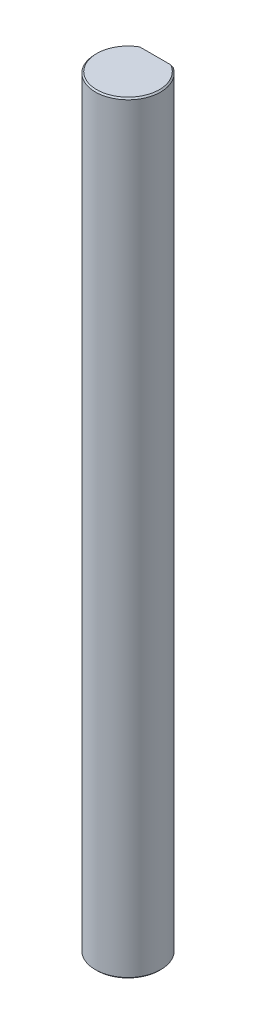
ISO-10303-21;
HEADER;
FILE_DESCRIPTION(('STEP AP214'),'2;1');
FILE_NAME('part.step','',(''),(''),'','','');
FILE_SCHEMA(('AUTOMOTIVE_DESIGN { 1 0 10303 214 1 1 1 1 }'));
ENDSEC;
DATA;
#1=APPLICATION_CONTEXT('core data for automotive mechanical design processes');
#2=APPLICATION_PROTOCOL_DEFINITION('international standard','automotive_design',2000,#1);
#3=PRODUCT_CONTEXT('',#1,'mechanical');
#4=PRODUCT('Part','Part','',(#3));
#5=PRODUCT_RELATED_PRODUCT_CATEGORY('part','',(#4));
#6=PRODUCT_DEFINITION_FORMATION('','',#4);
#7=PRODUCT_DEFINITION_CONTEXT('part definition',#1,'design');
#8=PRODUCT_DEFINITION('design','',#6,#7);
#9=PRODUCT_DEFINITION_SHAPE('','',#8);
#10=(LENGTH_UNIT() NAMED_UNIT(*) SI_UNIT(.MILLI.,.METRE.));
#11=(NAMED_UNIT(*) PLANE_ANGLE_UNIT() SI_UNIT($,.RADIAN.));
#12=(NAMED_UNIT(*) SI_UNIT($,.STERADIAN.) SOLID_ANGLE_UNIT());
#13=UNCERTAINTY_MEASURE_WITH_UNIT(LENGTH_MEASURE(1.E-05),#10,'distance_accuracy_value','');
#14=(GEOMETRIC_REPRESENTATION_CONTEXT(3) GLOBAL_UNCERTAINTY_ASSIGNED_CONTEXT((#13)) GLOBAL_UNIT_ASSIGNED_CONTEXT((#10,
#11,#12)) REPRESENTATION_CONTEXT('',''));
#15=CARTESIAN_POINT('',(0.,0.,0.));
#16=DIRECTION('',(0.,0.,1.));
#17=DIRECTION('',(1.,0.,0.));
#18=AXIS2_PLACEMENT_3D('',#15,#16,#17);
#19=CARTESIAN_POINT('',(0.,70.,0.));
#20=DIRECTION('',(0.,-1.,0.));
#21=DIRECTION('',(0.,0.,-1.));
#22=AXIS2_PLACEMENT_3D('',#19,#20,#21);
#23=CONICAL_SURFACE('',#22,2.875,0.785398163397467);
#24=CARTESIAN_POINT('',(-1.6583123951777,69.875,-2.5));
#25=CARTESIAN_POINT('',(-1.57973572193476,69.9184348904035,-2.5));
#26=CARTESIAN_POINT('',(-1.50022900034239,69.9602466964647,-2.5));
#27=CARTESIAN_POINT('',(-1.41972708645006,70.,-2.5));
#28=B_SPLINE_CURVE_WITH_KNOTS('',3,(#24,#25,#26,#27),.UNSPECIFIED.,.F.,.F.,(4,4),(0.,
0.000269347265701108),.UNSPECIFIED.);
#29=CARTESIAN_POINT('',(-1.6583123951777,69.875,-2.5));
#30=VERTEX_POINT('',#29);
#31=CARTESIAN_POINT('',(-1.41972708645006,70.,-2.5));
#32=VERTEX_POINT('',#31);
#33=EDGE_CURVE('E113',#30,#32,#28,.T.);
#34=ORIENTED_EDGE('',*,*,#33,.F.);
#35=CARTESIAN_POINT('',(0.,69.875,0.));
#36=DIRECTION('',(0.,-1.,0.));
#37=DIRECTION('',(0.,0.,1.));
#38=AXIS2_PLACEMENT_3D('',#35,#36,#37);
#39=CIRCLE('',#38,3.);
#40=CARTESIAN_POINT('',(1.6583123951777,69.875,-2.5));
#41=VERTEX_POINT('',#40);
#42=EDGE_CURVE('E77',#41,#30,#39,.T.);
#43=ORIENTED_EDGE('',*,*,#42,.F.);
#44=CARTESIAN_POINT('',(1.41972708645006,70.,-2.5));
#45=CARTESIAN_POINT('',(1.50022900034238,69.9602466964647,-2.5));
#46=CARTESIAN_POINT('',(1.57973572193476,69.9184348904036,-2.5));
#47=CARTESIAN_POINT('',(1.6583123951777,69.875,-2.5));
#48=B_SPLINE_CURVE_WITH_KNOTS('',3,(#44,#45,#46,#47),.UNSPECIFIED.,.F.,.F.,(4,4),(0.,
0.000269347265701108),.UNSPECIFIED.);
#49=CARTESIAN_POINT('',(1.41972708645006,70.,-2.5));
#50=VERTEX_POINT('',#49);
#51=EDGE_CURVE('E34',#50,#41,#48,.T.);
#52=ORIENTED_EDGE('',*,*,#51,.F.);
#53=CARTESIAN_POINT('',(0.,70.,0.));
#54=DIRECTION('',(0.,1.,0.));
#55=DIRECTION('',(0.,0.,1.));
#56=AXIS2_PLACEMENT_3D('',#53,#54,#55);
#57=CIRCLE('',#56,2.875);
#58=EDGE_CURVE('E13',#32,#50,#57,.T.);
#59=ORIENTED_EDGE('',*,*,#58,.F.);
#60=EDGE_LOOP('',(#34,#43,#52,#59));
#61=FACE_BOUND('',#60,.T.);
#62=ADVANCED_FACE('F24',(#61),#23,.T.);
#63=CARTESIAN_POINT('',(0.,0.,0.));
#64=DIRECTION('',(0.,1.,0.));
#65=DIRECTION('',(0.,0.,1.));
#66=AXIS2_PLACEMENT_3D('',#63,#64,#65);
#67=PLANE('',#66);
#68=DIRECTION('',(1.,0.,0.));
#69=VECTOR('',#68,1.);
#70=CARTESIAN_POINT('',(0.,0.,-2.5));
#71=LINE('',#70,#69);
#72=CARTESIAN_POINT('',(-1.41972708645007,0.,-2.5));
#73=VERTEX_POINT('',#72);
#74=CARTESIAN_POINT('',(1.41972708645007,0.,-2.5));
#75=VERTEX_POINT('',#74);
#76=EDGE_CURVE('E89',#73,#75,#71,.T.);
#77=ORIENTED_EDGE('',*,*,#76,.T.);
#78=CARTESIAN_POINT('',(0.,0.,0.));
#79=DIRECTION('',(0.,-1.,0.));
#80=DIRECTION('',(0.,0.,1.));
#81=AXIS2_PLACEMENT_3D('',#78,#79,#80);
#82=CIRCLE('',#81,2.875);
#83=EDGE_CURVE('E98',#75,#73,#82,.T.);
#84=ORIENTED_EDGE('',*,*,#83,.T.);
#85=EDGE_LOOP('',(#77,#84));
#86=FACE_BOUND('',#85,.T.);
#87=ADVANCED_FACE('F156',(#86),#67,.F.);
#88=CARTESIAN_POINT('',(0.,70.,0.));
#89=DIRECTION('',(0.,1.,0.));
#90=DIRECTION('',(0.,0.,1.));
#91=AXIS2_PLACEMENT_3D('',#88,#89,#90);
#92=PLANE('',#91);
#93=DIRECTION('',(1.,0.,0.));
#94=VECTOR('',#93,1.);
#95=CARTESIAN_POINT('',(0.,70.,-2.5));
#96=LINE('',#95,#94);
#97=EDGE_CURVE('E116',#32,#50,#96,.T.);
#98=ORIENTED_EDGE('',*,*,#97,.F.);
#99=ORIENTED_EDGE('',*,*,#58,.T.);
#100=EDGE_LOOP('',(#98,#99));
#101=FACE_BOUND('',#100,.T.);
#102=ADVANCED_FACE('F158',(#101),#92,.T.);
#103=CARTESIAN_POINT('',(0.,70.,-2.5));
#104=DIRECTION('',(0.,0.,-1.));
#105=DIRECTION('',(-1.,0.,0.));
#106=AXIS2_PLACEMENT_3D('',#103,#104,#105);
#107=PLANE('',#106);
#108=DIRECTION('',(0.,-1.,0.));
#109=VECTOR('',#108,1.);
#110=CARTESIAN_POINT('',(1.6583123951777,70.,-2.5));
#111=LINE('',#110,#109);
#112=CARTESIAN_POINT('',(1.6583123951777,0.125,-2.5));
#113=VERTEX_POINT('',#112);
#114=EDGE_CURVE('E81',#41,#113,#111,.T.);
#115=ORIENTED_EDGE('',*,*,#114,.T.);
#116=CARTESIAN_POINT('',(1.6583123951777,0.125,-2.5));
#117=CARTESIAN_POINT('',(1.57973572193476,0.0815651095964662,-2.5));
#118=CARTESIAN_POINT('',(1.5002290003424,0.0397533035352772,-2.5));
#119=CARTESIAN_POINT('',(1.41972708645007,0.,-2.5));
#120=B_SPLINE_CURVE_WITH_KNOTS('',3,(#116,#117,#118,#119),.UNSPECIFIED.,.F.,.F.,(4,4),(0.,
0.000269347265701095),.UNSPECIFIED.);
#121=EDGE_CURVE('E96',#113,#75,#120,.T.);
#122=ORIENTED_EDGE('',*,*,#121,.T.);
#123=ORIENTED_EDGE('',*,*,#76,.F.);
#124=CARTESIAN_POINT('',(-1.41972708645007,0.,-2.5));
#125=CARTESIAN_POINT('',(-1.50022900034239,0.039753303535301,-2.5));
#126=CARTESIAN_POINT('',(-1.57973572193477,0.0815651095964539,-2.5));
#127=CARTESIAN_POINT('',(-1.6583123951777,0.125,-2.5));
#128=B_SPLINE_CURVE_WITH_KNOTS('',3,(#124,#125,#126,#127),.UNSPECIFIED.,.F.,.F.,(4,4),(0.,
0.000269347265701095),.UNSPECIFIED.);
#129=CARTESIAN_POINT('',(-1.6583123951777,0.125,-2.5));
#130=VERTEX_POINT('',#129);
#131=EDGE_CURVE('E82',#73,#130,#128,.T.);
#132=ORIENTED_EDGE('',*,*,#131,.T.);
#133=DIRECTION('',(0.,-1.,0.));
#134=VECTOR('',#133,1.);
#135=CARTESIAN_POINT('',(-1.6583123951777,70.,-2.5));
#136=LINE('',#135,#134);
#137=EDGE_CURVE('E69',#30,#130,#136,.T.);
#138=ORIENTED_EDGE('',*,*,#137,.F.);
#139=ORIENTED_EDGE('',*,*,#33,.T.);
#140=ORIENTED_EDGE('',*,*,#97,.T.);
#141=ORIENTED_EDGE('',*,*,#51,.T.);
#142=EDGE_LOOP('',(#115,#122,#123,#132,#138,#139,#140,#141));
#143=FACE_BOUND('',#142,.T.);
#144=ADVANCED_FACE('F86',(#143),#107,.T.);
#145=CARTESIAN_POINT('',(0.,70.,0.));
#146=DIRECTION('',(0.,-1.,0.));
#147=DIRECTION('',(0.,0.,-1.));
#148=AXIS2_PLACEMENT_3D('',#145,#146,#147);
#149=CYLINDRICAL_SURFACE('',#148,3.);
#150=ORIENTED_EDGE('',*,*,#137,.T.);
#151=CARTESIAN_POINT('',(0.,0.125,0.));
#152=DIRECTION('',(0.,1.,0.));
#153=DIRECTION('',(0.,0.,1.));
#154=AXIS2_PLACEMENT_3D('',#151,#152,#153);
#155=CIRCLE('',#154,3.);
#156=EDGE_CURVE('E74',#130,#113,#155,.T.);
#157=ORIENTED_EDGE('',*,*,#156,.T.);
#158=ORIENTED_EDGE('',*,*,#114,.F.);
#159=ORIENTED_EDGE('',*,*,#42,.T.);
#160=EDGE_LOOP('',(#150,#157,#158,#159));
#161=FACE_BOUND('',#160,.T.);
#162=ADVANCED_FACE('F71',(#161),#149,.T.);
#163=CARTESIAN_POINT('',(0.,0.125,0.));
#164=DIRECTION('',(0.,1.,0.));
#165=DIRECTION('',(0.,0.,1.));
#166=AXIS2_PLACEMENT_3D('',#163,#164,#165);
#167=CONICAL_SURFACE('',#166,3.,0.785398163397438);
#168=ORIENTED_EDGE('',*,*,#83,.F.);
#169=ORIENTED_EDGE('',*,*,#121,.F.);
#170=ORIENTED_EDGE('',*,*,#156,.F.);
#171=ORIENTED_EDGE('',*,*,#131,.F.);
#172=EDGE_LOOP('',(#168,#169,#170,#171));
#173=FACE_BOUND('',#172,.T.);
#174=ADVANCED_FACE('F95',(#173),#167,.T.);
#175=CLOSED_SHELL('',(#62,#87,#102,#144,#162,#174));
#176=MANIFOLD_SOLID_BREP('B1',#175);
#177=ADVANCED_BREP_SHAPE_REPRESENTATION('',(#18,#176),#14);
#178=SHAPE_DEFINITION_REPRESENTATION(#9,#177);
ENDSEC;
END-ISO-10303-21;
